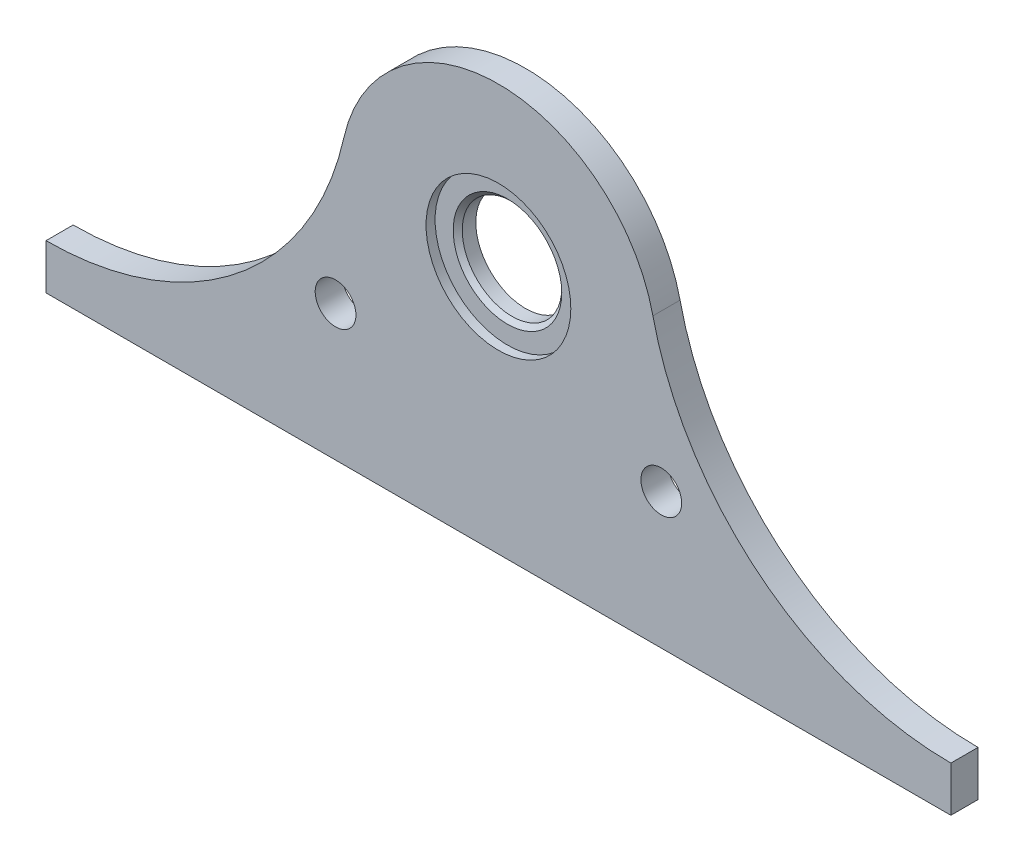
ISO-10303-21;
HEADER;
FILE_DESCRIPTION(('STEP AP214'),'2;1');
FILE_NAME('part.step','',(''),(''),'','','');
FILE_SCHEMA(('AUTOMOTIVE_DESIGN { 1 0 10303 214 1 1 1 1 }'));
ENDSEC;
DATA;
#1=APPLICATION_CONTEXT('core data for automotive mechanical design processes');
#2=APPLICATION_PROTOCOL_DEFINITION('international standard','automotive_design',2000,#1);
#3=PRODUCT_CONTEXT('',#1,'mechanical');
#4=PRODUCT('Part','Part','',(#3));
#5=PRODUCT_RELATED_PRODUCT_CATEGORY('part','',(#4));
#6=PRODUCT_DEFINITION_FORMATION('','',#4);
#7=PRODUCT_DEFINITION_CONTEXT('part definition',#1,'design');
#8=PRODUCT_DEFINITION('design','',#6,#7);
#9=PRODUCT_DEFINITION_SHAPE('','',#8);
#10=(LENGTH_UNIT() NAMED_UNIT(*) SI_UNIT(.MILLI.,.METRE.));
#11=(NAMED_UNIT(*) PLANE_ANGLE_UNIT() SI_UNIT($,.RADIAN.));
#12=(NAMED_UNIT(*) SI_UNIT($,.STERADIAN.) SOLID_ANGLE_UNIT());
#13=UNCERTAINTY_MEASURE_WITH_UNIT(LENGTH_MEASURE(1.E-05),#10,'distance_accuracy_value','');
#14=(GEOMETRIC_REPRESENTATION_CONTEXT(3) GLOBAL_UNCERTAINTY_ASSIGNED_CONTEXT((#13)) GLOBAL_UNIT_ASSIGNED_CONTEXT((#10,
#11,#12)) REPRESENTATION_CONTEXT('',''));
#15=CARTESIAN_POINT('',(0.,0.,0.));
#16=DIRECTION('',(0.,0.,1.));
#17=DIRECTION('',(1.,0.,0.));
#18=AXIS2_PLACEMENT_3D('',#15,#16,#17);
#19=CARTESIAN_POINT('',(0.,0.,2.5));
#20=DIRECTION('',(0.,0.,1.));
#21=DIRECTION('',(1.,0.,0.));
#22=AXIS2_PLACEMENT_3D('',#19,#20,#21);
#23=CYLINDRICAL_SURFACE('',#22,8.);
#24=CARTESIAN_POINT('',(0.,0.,2.));
#25=DIRECTION('',(0.,0.,1.));
#26=DIRECTION('',(1.,0.,0.));
#27=AXIS2_PLACEMENT_3D('',#24,#25,#26);
#28=CIRCLE('',#27,8.);
#29=CARTESIAN_POINT('',(8.,0.,2.));
#30=VERTEX_POINT('',#29);
#31=EDGE_CURVE('E20',#30,#30,#28,.T.);
#32=ORIENTED_EDGE('',*,*,#31,.F.);
#33=EDGE_LOOP('',(#32));
#34=FACE_BOUND('',#33,.T.);
#35=CARTESIAN_POINT('',(0.,0.,3.));
#36=DIRECTION('',(0.,0.,1.));
#37=DIRECTION('',(1.,0.,0.));
#38=AXIS2_PLACEMENT_3D('',#35,#36,#37);
#39=CIRCLE('',#38,8.);
#40=CARTESIAN_POINT('',(8.,0.,3.));
#41=VERTEX_POINT('',#40);
#42=EDGE_CURVE('E90',#41,#41,#39,.F.);
#43=ORIENTED_EDGE('',*,*,#42,.F.);
#44=EDGE_LOOP('',(#43));
#45=FACE_BOUND('',#44,.T.);
#46=ADVANCED_FACE('F17',(#34,#45),#23,.F.);
#47=CARTESIAN_POINT('',(0.,0.,2.));
#48=DIRECTION('',(0.,0.,1.));
#49=DIRECTION('',(1.,0.,0.));
#50=AXIS2_PLACEMENT_3D('',#47,#48,#49);
#51=PLANE('',#50);
#52=CARTESIAN_POINT('',(0.,0.,2.00000000006639));
#53=DIRECTION('',(0.,0.,1.));
#54=DIRECTION('',(1.,0.,0.));
#55=AXIS2_PLACEMENT_3D('',#52,#53,#54);
#56=CIRCLE('',#55,5.99999999997181);
#57=CARTESIAN_POINT('',(5.99999999997181,0.,2.00000000006639));
#58=VERTEX_POINT('',#57);
#59=EDGE_CURVE('E71',#58,#58,#56,.F.);
#60=ORIENTED_EDGE('',*,*,#59,.T.);
#61=EDGE_LOOP('',(#60));
#62=FACE_BOUND('',#61,.T.);
#63=ORIENTED_EDGE('',*,*,#31,.T.);
#64=EDGE_LOOP('',(#63));
#65=FACE_BOUND('',#64,.T.);
#66=ADVANCED_FACE('F97',(#62,#65),#51,.T.);
#67=CARTESIAN_POINT('',(0.,-3.22990731331823E-06,3.));
#68=DIRECTION('',(0.,0.,1.));
#69=DIRECTION('',(1.,0.,0.));
#70=AXIS2_PLACEMENT_3D('',#67,#68,#69);
#71=PLANE('',#70);
#72=ORIENTED_EDGE('',*,*,#42,.T.);
#73=EDGE_LOOP('',(#72));
#74=FACE_BOUND('',#73,.T.);
#75=CARTESIAN_POINT('',(18.,-12.5,3.00000000000002));
#76=DIRECTION('',(0.,0.,1.));
#77=DIRECTION('',(1.,0.,0.));
#78=AXIS2_PLACEMENT_3D('',#75,#76,#77);
#79=CIRCLE('',#78,2.25);
#80=CARTESIAN_POINT('',(20.25,-12.5,3.00000000000002));
#81=VERTEX_POINT('',#80);
#82=EDGE_CURVE('E83',#81,#81,#79,.F.);
#83=ORIENTED_EDGE('',*,*,#82,.T.);
#84=EDGE_LOOP('',(#83));
#85=FACE_BOUND('',#84,.T.);
#86=CARTESIAN_POINT('',(-18.,-12.5,3.00000000000002));
#87=DIRECTION('',(0.,0.,1.));
#88=DIRECTION('',(1.,0.,0.));
#89=AXIS2_PLACEMENT_3D('',#86,#87,#88);
#90=CIRCLE('',#89,2.25);
#91=CARTESIAN_POINT('',(-15.75,-12.5,3.00000000000002));
#92=VERTEX_POINT('',#91);
#93=EDGE_CURVE('E80',#92,#92,#90,.F.);
#94=ORIENTED_EDGE('',*,*,#93,.T.);
#95=EDGE_LOOP('',(#94));
#96=FACE_BOUND('',#95,.T.);
#97=DIRECTION('',(0.,1.,0.));
#98=VECTOR('',#97,1.);
#99=CARTESIAN_POINT('',(50.,-27.5,3.));
#100=LINE('',#99,#98);
#101=CARTESIAN_POINT('',(50.,-22.5,3.));
#102=VERTEX_POINT('',#101);
#103=CARTESIAN_POINT('',(50.,-27.5,3.));
#104=VERTEX_POINT('',#103);
#105=EDGE_CURVE('E190',#102,#104,#100,.F.);
#106=ORIENTED_EDGE('',*,*,#105,.F.);
#107=CARTESIAN_POINT('',(50.,11.25,3.));
#108=DIRECTION('',(0.,0.,1.));
#109=DIRECTION('',(1.,0.,0.));
#110=AXIS2_PLACEMENT_3D('',#107,#108,#109);
#111=CIRCLE('',#110,33.75);
#112=CARTESIAN_POINT('',(17.0731707317073,3.84146341463415,3.));
#113=VERTEX_POINT('',#112);
#114=EDGE_CURVE('E79',#102,#113,#111,.F.);
#115=ORIENTED_EDGE('',*,*,#114,.T.);
#116=CARTESIAN_POINT('',(0.,0.,3.));
#117=DIRECTION('',(0.,0.,1.));
#118=DIRECTION('',(1.,0.,0.));
#119=AXIS2_PLACEMENT_3D('',#116,#117,#118);
#120=CIRCLE('',#119,17.5);
#121=CARTESIAN_POINT('',(-17.0731707317073,3.84146341463415,3.));
#122=VERTEX_POINT('',#121);
#123=EDGE_CURVE('E74',#122,#113,#120,.F.);
#124=ORIENTED_EDGE('',*,*,#123,.F.);
#125=CARTESIAN_POINT('',(-50.,11.25,3.));
#126=DIRECTION('',(0.,0.,1.));
#127=DIRECTION('',(1.,0.,0.));
#128=AXIS2_PLACEMENT_3D('',#125,#126,#127);
#129=CIRCLE('',#128,33.75);
#130=CARTESIAN_POINT('',(-50.,-22.5,3.));
#131=VERTEX_POINT('',#130);
#132=EDGE_CURVE('E61',#122,#131,#129,.F.);
#133=ORIENTED_EDGE('',*,*,#132,.T.);
#134=DIRECTION('',(0.,1.,0.));
#135=VECTOR('',#134,1.);
#136=CARTESIAN_POINT('',(-50.,-22.5,3.));
#137=LINE('',#136,#135);
#138=CARTESIAN_POINT('',(-50.,-27.5,3.));
#139=VERTEX_POINT('',#138);
#140=EDGE_CURVE('E70',#139,#131,#137,.T.);
#141=ORIENTED_EDGE('',*,*,#140,.F.);
#142=DIRECTION('',(1.,0.,0.));
#143=VECTOR('',#142,1.);
#144=CARTESIAN_POINT('',(-50.,-27.5,3.));
#145=LINE('',#144,#143);
#146=EDGE_CURVE('E201',#104,#139,#145,.F.);
#147=ORIENTED_EDGE('',*,*,#146,.F.);
#148=EDGE_LOOP('',(#106,#115,#124,#133,#141,#147));
#149=FACE_BOUND('',#148,.T.);
#150=ADVANCED_FACE('F77',(#74,#85,#96,#149),#71,.T.);
#151=CARTESIAN_POINT('',(0.,0.,2.00000000006639));
#152=DIRECTION('',(0.,0.,1.));
#153=DIRECTION('',(1.,0.,0.));
#154=AXIS2_PLACEMENT_3D('',#151,#152,#153);
#155=CONICAL_SURFACE('',#154,5.99999999997181,0.785398163397448);
#156=ORIENTED_EDGE('',*,*,#59,.F.);
#157=EDGE_LOOP('',(#156));
#158=FACE_BOUND('',#157,.T.);
#159=CARTESIAN_POINT('',(0.,0.,1.49999999999999));
#160=DIRECTION('',(0.,0.,1.));
#161=DIRECTION('',(1.,0.,0.));
#162=AXIS2_PLACEMENT_3D('',#159,#160,#161);
#163=CIRCLE('',#162,5.5);
#164=CARTESIAN_POINT('',(5.5,0.,1.49999999999999));
#165=VERTEX_POINT('',#164);
#166=EDGE_CURVE('E175',#165,#165,#163,.F.);
#167=ORIENTED_EDGE('',*,*,#166,.T.);
#168=EDGE_LOOP('',(#167));
#169=FACE_BOUND('',#168,.T.);
#170=ADVANCED_FACE('F147',(#158,#169),#155,.F.);
#171=CARTESIAN_POINT('',(-50.,11.25,0.));
#172=DIRECTION('',(0.,0.,1.));
#173=DIRECTION('',(1.,0.,0.));
#174=AXIS2_PLACEMENT_3D('',#171,#172,#173);
#175=CYLINDRICAL_SURFACE('',#174,33.75);
#176=DIRECTION('',(0.,0.,1.));
#177=VECTOR('',#176,1.);
#178=CARTESIAN_POINT('',(-50.,-22.5,0.));
#179=LINE('',#178,#177);
#180=CARTESIAN_POINT('',(-50.,-22.5,0.));
#181=VERTEX_POINT('',#180);
#182=EDGE_CURVE('E66',#131,#181,#179,.F.);
#183=ORIENTED_EDGE('',*,*,#182,.F.);
#184=ORIENTED_EDGE('',*,*,#132,.F.);
#185=DIRECTION('',(0.,0.,1.));
#186=VECTOR('',#185,1.);
#187=CARTESIAN_POINT('',(-17.0731707317073,3.84146341463416,0.));
#188=LINE('',#187,#186);
#189=CARTESIAN_POINT('',(-17.0731707317073,3.84146341463415,0.));
#190=VERTEX_POINT('',#189);
#191=EDGE_CURVE('E65',#190,#122,#188,.T.);
#192=ORIENTED_EDGE('',*,*,#191,.F.);
#193=CARTESIAN_POINT('',(-50.,11.25,0.));
#194=DIRECTION('',(0.,0.,1.));
#195=DIRECTION('',(1.,0.,0.));
#196=AXIS2_PLACEMENT_3D('',#193,#194,#195);
#197=CIRCLE('',#196,33.75);
#198=EDGE_CURVE('E173',#190,#181,#197,.F.);
#199=ORIENTED_EDGE('',*,*,#198,.T.);
#200=EDGE_LOOP('',(#183,#184,#192,#199));
#201=FACE_BOUND('',#200,.T.);
#202=ADVANCED_FACE('F63',(#201),#175,.F.);
#203=CARTESIAN_POINT('',(-50.,-22.5,0.));
#204=DIRECTION('',(-1.,0.,0.));
#205=DIRECTION('',(0.,0.,1.));
#206=AXIS2_PLACEMENT_3D('',#203,#204,#205);
#207=PLANE('',#206);
#208=ORIENTED_EDGE('',*,*,#140,.T.);
#209=ORIENTED_EDGE('',*,*,#182,.T.);
#210=DIRECTION('',(0.,1.,0.));
#211=VECTOR('',#210,1.);
#212=CARTESIAN_POINT('',(-50.,-3.22990731331823E-06,0.));
#213=LINE('',#212,#211);
#214=CARTESIAN_POINT('',(-50.,-27.5,0.));
#215=VERTEX_POINT('',#214);
#216=EDGE_CURVE('E174',#181,#215,#213,.F.);
#217=ORIENTED_EDGE('',*,*,#216,.T.);
#218=DIRECTION('',(0.,0.,-1.));
#219=VECTOR('',#218,1.);
#220=CARTESIAN_POINT('',(-50.,-27.5,0.));
#221=LINE('',#220,#219);
#222=EDGE_CURVE('E198',#139,#215,#221,.T.);
#223=ORIENTED_EDGE('',*,*,#222,.F.);
#224=EDGE_LOOP('',(#208,#209,#217,#223));
#225=FACE_BOUND('',#224,.T.);
#226=ADVANCED_FACE('F140',(#225),#207,.T.);
#227=CARTESIAN_POINT('',(-50.,-27.5,0.));
#228=DIRECTION('',(0.,-1.,0.));
#229=DIRECTION('',(0.,0.,-1.));
#230=AXIS2_PLACEMENT_3D('',#227,#228,#229);
#231=PLANE('',#230);
#232=ORIENTED_EDGE('',*,*,#146,.T.);
#233=ORIENTED_EDGE('',*,*,#222,.T.);
#234=DIRECTION('',(1.,0.,0.));
#235=VECTOR('',#234,1.);
#236=CARTESIAN_POINT('',(0.,-27.5,0.));
#237=LINE('',#236,#235);
#238=CARTESIAN_POINT('',(50.,-27.5,0.));
#239=VERTEX_POINT('',#238);
#240=EDGE_CURVE('E193',#215,#239,#237,.T.);
#241=ORIENTED_EDGE('',*,*,#240,.T.);
#242=DIRECTION('',(0.,0.,1.));
#243=VECTOR('',#242,1.);
#244=CARTESIAN_POINT('',(50.,-27.5,0.));
#245=LINE('',#244,#243);
#246=EDGE_CURVE('E187',#104,#239,#245,.F.);
#247=ORIENTED_EDGE('',*,*,#246,.F.);
#248=EDGE_LOOP('',(#232,#233,#241,#247));
#249=FACE_BOUND('',#248,.T.);
#250=ADVANCED_FACE('F136',(#249),#231,.T.);
#251=CARTESIAN_POINT('',(50.,-27.5,0.));
#252=DIRECTION('',(1.,0.,0.));
#253=DIRECTION('',(0.,1.,0.));
#254=AXIS2_PLACEMENT_3D('',#251,#252,#253);
#255=PLANE('',#254);
#256=ORIENTED_EDGE('',*,*,#105,.T.);
#257=ORIENTED_EDGE('',*,*,#246,.T.);
#258=DIRECTION('',(0.,1.,0.));
#259=VECTOR('',#258,1.);
#260=CARTESIAN_POINT('',(50.,-3.22990731331823E-06,0.));
#261=LINE('',#260,#259);
#262=CARTESIAN_POINT('',(50.,-22.5,0.));
#263=VERTEX_POINT('',#262);
#264=EDGE_CURVE('E172',#239,#263,#261,.T.);
#265=ORIENTED_EDGE('',*,*,#264,.T.);
#266=DIRECTION('',(0.,0.,1.));
#267=VECTOR('',#266,1.);
#268=CARTESIAN_POINT('',(50.,-22.5,0.));
#269=LINE('',#268,#267);
#270=EDGE_CURVE('E87',#263,#102,#269,.T.);
#271=ORIENTED_EDGE('',*,*,#270,.T.);
#272=EDGE_LOOP('',(#256,#257,#265,#271));
#273=FACE_BOUND('',#272,.T.);
#274=ADVANCED_FACE('F132',(#273),#255,.T.);
#275=CARTESIAN_POINT('',(50.,11.25,0.));
#276=DIRECTION('',(0.,0.,1.));
#277=DIRECTION('',(1.,0.,0.));
#278=AXIS2_PLACEMENT_3D('',#275,#276,#277);
#279=CYLINDRICAL_SURFACE('',#278,33.75);
#280=DIRECTION('',(0.,0.,1.));
#281=VECTOR('',#280,1.);
#282=CARTESIAN_POINT('',(17.0731707317073,3.84146341463414,0.));
#283=LINE('',#282,#281);
#284=CARTESIAN_POINT('',(17.0731707317073,3.84146341463415,0.));
#285=VERTEX_POINT('',#284);
#286=EDGE_CURVE('E35',#113,#285,#283,.F.);
#287=ORIENTED_EDGE('',*,*,#286,.F.);
#288=ORIENTED_EDGE('',*,*,#114,.F.);
#289=ORIENTED_EDGE('',*,*,#270,.F.);
#290=CARTESIAN_POINT('',(50.,11.25,0.));
#291=DIRECTION('',(0.,0.,1.));
#292=DIRECTION('',(1.,0.,0.));
#293=AXIS2_PLACEMENT_3D('',#290,#291,#292);
#294=CIRCLE('',#293,33.75);
#295=EDGE_CURVE('E167',#263,#285,#294,.F.);
#296=ORIENTED_EDGE('',*,*,#295,.T.);
#297=EDGE_LOOP('',(#287,#288,#289,#296));
#298=FACE_BOUND('',#297,.T.);
#299=ADVANCED_FACE('F129',(#298),#279,.F.);
#300=CARTESIAN_POINT('',(0.,0.,0.));
#301=DIRECTION('',(0.,0.,1.));
#302=DIRECTION('',(1.,0.,0.));
#303=AXIS2_PLACEMENT_3D('',#300,#301,#302);
#304=CYLINDRICAL_SURFACE('',#303,17.5);
#305=ORIENTED_EDGE('',*,*,#191,.T.);
#306=ORIENTED_EDGE('',*,*,#123,.T.);
#307=ORIENTED_EDGE('',*,*,#286,.T.);
#308=CARTESIAN_POINT('',(0.,0.,0.));
#309=DIRECTION('',(0.,0.,1.));
#310=DIRECTION('',(1.,0.,0.));
#311=AXIS2_PLACEMENT_3D('',#308,#309,#310);
#312=CIRCLE('',#311,17.5);
#313=EDGE_CURVE('E75',#285,#190,#312,.T.);
#314=ORIENTED_EDGE('',*,*,#313,.T.);
#315=EDGE_LOOP('',(#305,#306,#307,#314));
#316=FACE_BOUND('',#315,.T.);
#317=ADVANCED_FACE('F73',(#316),#304,.T.);
#318=CARTESIAN_POINT('',(-18.,-12.5,109.69958978957));
#319=DIRECTION('',(0.,0.,1.));
#320=DIRECTION('',(1.,0.,0.));
#321=AXIS2_PLACEMENT_3D('',#318,#319,#320);
#322=CYLINDRICAL_SURFACE('',#321,2.25);
#323=ORIENTED_EDGE('',*,*,#93,.F.);
#324=EDGE_LOOP('',(#323));
#325=FACE_BOUND('',#324,.T.);
#326=CARTESIAN_POINT('',(-18.,-12.5,0.));
#327=DIRECTION('',(0.,0.,1.));
#328=DIRECTION('',(1.,0.,0.));
#329=AXIS2_PLACEMENT_3D('',#326,#327,#328);
#330=CIRCLE('',#329,2.25);
#331=CARTESIAN_POINT('',(-15.75,-12.5,0.));
#332=VERTEX_POINT('',#331);
#333=EDGE_CURVE('E162',#332,#332,#330,.F.);
#334=ORIENTED_EDGE('',*,*,#333,.T.);
#335=EDGE_LOOP('',(#334));
#336=FACE_BOUND('',#335,.T.);
#337=ADVANCED_FACE('F122',(#325,#336),#322,.F.);
#338=CARTESIAN_POINT('',(18.,-12.5,109.69958978957));
#339=DIRECTION('',(0.,0.,1.));
#340=DIRECTION('',(1.,0.,0.));
#341=AXIS2_PLACEMENT_3D('',#338,#339,#340);
#342=CYLINDRICAL_SURFACE('',#341,2.25);
#343=ORIENTED_EDGE('',*,*,#82,.F.);
#344=EDGE_LOOP('',(#343));
#345=FACE_BOUND('',#344,.T.);
#346=CARTESIAN_POINT('',(18.,-12.5,0.));
#347=DIRECTION('',(0.,0.,1.));
#348=DIRECTION('',(1.,0.,0.));
#349=AXIS2_PLACEMENT_3D('',#346,#347,#348);
#350=CIRCLE('',#349,2.25);
#351=CARTESIAN_POINT('',(20.25,-12.5,0.));
#352=VERTEX_POINT('',#351);
#353=EDGE_CURVE('E26',#352,#352,#350,.F.);
#354=ORIENTED_EDGE('',*,*,#353,.T.);
#355=EDGE_LOOP('',(#354));
#356=FACE_BOUND('',#355,.T.);
#357=ADVANCED_FACE('F114',(#345,#356),#342,.F.);
#358=CARTESIAN_POINT('',(0.,0.,-106.69958978957));
#359=DIRECTION('',(0.,0.,1.));
#360=DIRECTION('',(1.,0.,0.));
#361=AXIS2_PLACEMENT_3D('',#358,#359,#360);
#362=CYLINDRICAL_SURFACE('',#361,5.5);
#363=CARTESIAN_POINT('',(0.,0.,0.));
#364=DIRECTION('',(0.,0.,1.));
#365=DIRECTION('',(1.,0.,0.));
#366=AXIS2_PLACEMENT_3D('',#363,#364,#365);
#367=CIRCLE('',#366,5.5);
#368=CARTESIAN_POINT('',(5.5,0.,0.));
#369=VERTEX_POINT('',#368);
#370=EDGE_CURVE('E11',#369,#369,#367,.F.);
#371=ORIENTED_EDGE('',*,*,#370,.T.);
#372=EDGE_LOOP('',(#371));
#373=FACE_BOUND('',#372,.T.);
#374=ORIENTED_EDGE('',*,*,#166,.F.);
#375=EDGE_LOOP('',(#374));
#376=FACE_BOUND('',#375,.T.);
#377=ADVANCED_FACE('F108',(#373,#376),#362,.F.);
#378=CARTESIAN_POINT('',(0.,-3.22990731331823E-06,0.));
#379=DIRECTION('',(0.,0.,1.));
#380=DIRECTION('',(1.,0.,0.));
#381=AXIS2_PLACEMENT_3D('',#378,#379,#380);
#382=PLANE('',#381);
#383=ORIENTED_EDGE('',*,*,#370,.F.);
#384=EDGE_LOOP('',(#383));
#385=FACE_BOUND('',#384,.T.);
#386=ORIENTED_EDGE('',*,*,#353,.F.);
#387=EDGE_LOOP('',(#386));
#388=FACE_BOUND('',#387,.T.);
#389=ORIENTED_EDGE('',*,*,#333,.F.);
#390=EDGE_LOOP('',(#389));
#391=FACE_BOUND('',#390,.T.);
#392=ORIENTED_EDGE('',*,*,#295,.F.);
#393=ORIENTED_EDGE('',*,*,#264,.F.);
#394=ORIENTED_EDGE('',*,*,#240,.F.);
#395=ORIENTED_EDGE('',*,*,#216,.F.);
#396=ORIENTED_EDGE('',*,*,#198,.F.);
#397=ORIENTED_EDGE('',*,*,#313,.F.);
#398=EDGE_LOOP('',(#392,#393,#394,#395,#396,#397));
#399=FACE_BOUND('',#398,.T.);
#400=ADVANCED_FACE('F106',(#385,#388,#391,#399),#382,.F.);
#401=CLOSED_SHELL('',(#46,#66,#150,#170,#202,#226,#250,#274,#299,#317,#337,#357,#377,#400));
#402=MANIFOLD_SOLID_BREP('B1',#401);
#403=ADVANCED_BREP_SHAPE_REPRESENTATION('',(#18,#402),#14);
#404=SHAPE_DEFINITION_REPRESENTATION(#9,#403);
ENDSEC;
END-ISO-10303-21;
